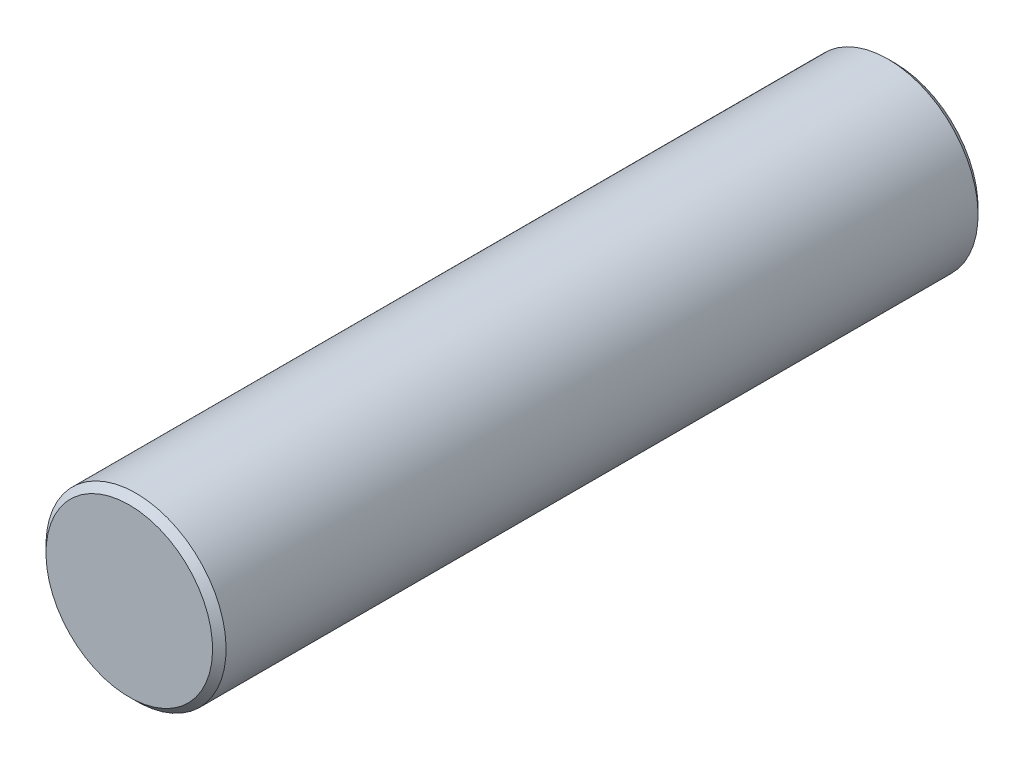
ISO-10303-21;
HEADER;
FILE_DESCRIPTION(('STEP AP214'),'2;1');
FILE_NAME('part.step','',(''),(''),'','','');
FILE_SCHEMA(('AUTOMOTIVE_DESIGN { 1 0 10303 214 1 1 1 1 }'));
ENDSEC;
DATA;
#1=APPLICATION_CONTEXT('core data for automotive mechanical design processes');
#2=APPLICATION_PROTOCOL_DEFINITION('international standard','automotive_design',2000,#1);
#3=PRODUCT_CONTEXT('',#1,'mechanical');
#4=PRODUCT('Part','Part','',(#3));
#5=PRODUCT_RELATED_PRODUCT_CATEGORY('part','',(#4));
#6=PRODUCT_DEFINITION_FORMATION('','',#4);
#7=PRODUCT_DEFINITION_CONTEXT('part definition',#1,'design');
#8=PRODUCT_DEFINITION('design','',#6,#7);
#9=PRODUCT_DEFINITION_SHAPE('','',#8);
#10=(LENGTH_UNIT() NAMED_UNIT(*) SI_UNIT(.MILLI.,.METRE.));
#11=(NAMED_UNIT(*) PLANE_ANGLE_UNIT() SI_UNIT($,.RADIAN.));
#12=(NAMED_UNIT(*) SI_UNIT($,.STERADIAN.) SOLID_ANGLE_UNIT());
#13=UNCERTAINTY_MEASURE_WITH_UNIT(LENGTH_MEASURE(1.E-05),#10,'distance_accuracy_value','');
#14=(GEOMETRIC_REPRESENTATION_CONTEXT(3) GLOBAL_UNCERTAINTY_ASSIGNED_CONTEXT((#13)) GLOBAL_UNIT_ASSIGNED_CONTEXT((#10,
#11,#12)) REPRESENTATION_CONTEXT('',''));
#15=CARTESIAN_POINT('',(0.,0.,0.));
#16=DIRECTION('',(0.,0.,1.));
#17=DIRECTION('',(1.,0.,0.));
#18=AXIS2_PLACEMENT_3D('',#15,#16,#17);
#19=CARTESIAN_POINT('',(0.,9.25,0.));
#20=DIRECTION('',(0.,0.,-1.));
#21=DIRECTION('',(0.,1.,0.));
#22=AXIS2_PLACEMENT_3D('',#19,#20,#21);
#23=PLANE('',#22);
#24=CARTESIAN_POINT('',(0.,0.,0.));
#25=DIRECTION('',(0.,0.,-1.));
#26=DIRECTION('',(0.,1.,0.));
#27=AXIS2_PLACEMENT_3D('',#24,#25,#26);
#28=CIRCLE('',#27,18.5);
#29=CARTESIAN_POINT('',(0.,18.5,0.));
#30=VERTEX_POINT('',#29);
#31=EDGE_CURVE('E9',#30,#30,#28,.T.);
#32=ORIENTED_EDGE('',*,*,#31,.T.);
#33=EDGE_LOOP('',(#32));
#34=FACE_BOUND('',#33,.T.);
#35=CARTESIAN_POINT('',(0.,0.,0.));
#36=DIRECTION('',(0.,0.,1.));
#37=DIRECTION('',(-1.,0.,0.));
#38=AXIS2_PLACEMENT_3D('',#35,#36,#37);
#39=CIRCLE('',#38,6.);
#40=CARTESIAN_POINT('',(-6.,0.,0.));
#41=VERTEX_POINT('',#40);
#42=EDGE_CURVE('E52',#41,#41,#39,.T.);
#43=ORIENTED_EDGE('',*,*,#42,.T.);
#44=EDGE_LOOP('',(#43));
#45=FACE_BOUND('',#44,.T.);
#46=ADVANCED_FACE('F15',(#34,#45),#23,.T.);
#47=CARTESIAN_POINT('',(0.,0.,0.75));
#48=DIRECTION('',(0.,0.,1.));
#49=DIRECTION('',(0.,1.,0.));
#50=AXIS2_PLACEMENT_3D('',#47,#48,#49);
#51=CONICAL_SURFACE('',#50,19.25,0.785398163397448);
#52=CARTESIAN_POINT('',(0.,0.,1.5));
#53=DIRECTION('',(0.,0.,-1.));
#54=DIRECTION('',(0.,1.,0.));
#55=AXIS2_PLACEMENT_3D('',#52,#53,#54);
#56=CIRCLE('',#55,20.);
#57=CARTESIAN_POINT('',(0.,20.,1.5));
#58=VERTEX_POINT('',#57);
#59=EDGE_CURVE('E25',#58,#58,#56,.T.);
#60=ORIENTED_EDGE('',*,*,#59,.T.);
#61=EDGE_LOOP('',(#60));
#62=FACE_BOUND('',#61,.T.);
#63=ORIENTED_EDGE('',*,*,#31,.F.);
#64=EDGE_LOOP('',(#63));
#65=FACE_BOUND('',#64,.T.);
#66=ADVANCED_FACE('F121',(#62,#65),#51,.T.);
#67=CARTESIAN_POINT('',(0.,0.,85.));
#68=DIRECTION('',(0.,0.,1.));
#69=DIRECTION('',(0.,1.,0.));
#70=AXIS2_PLACEMENT_3D('',#67,#68,#69);
#71=CYLINDRICAL_SURFACE('',#70,20.);
#72=CARTESIAN_POINT('',(0.,0.,168.5));
#73=DIRECTION('',(0.,0.,-1.));
#74=DIRECTION('',(0.,1.,0.));
#75=AXIS2_PLACEMENT_3D('',#72,#73,#74);
#76=CIRCLE('',#75,20.);
#77=CARTESIAN_POINT('',(0.,20.,168.5));
#78=VERTEX_POINT('',#77);
#79=EDGE_CURVE('E19',#78,#78,#76,.T.);
#80=ORIENTED_EDGE('',*,*,#79,.T.);
#81=EDGE_LOOP('',(#80));
#82=FACE_BOUND('',#81,.T.);
#83=ORIENTED_EDGE('',*,*,#59,.F.);
#84=EDGE_LOOP('',(#83));
#85=FACE_BOUND('',#84,.T.);
#86=CARTESIAN_POINT('',(0.,0.,6.5));
#87=DIRECTION('',(0.,0.,-1.));
#88=DIRECTION('',(0.,1.,0.));
#89=AXIS2_PLACEMENT_3D('',#86,#87,#88);
#90=CIRCLE('',#89,20.);
#91=CARTESIAN_POINT('',(10.5356537528527,-17.,6.5));
#92=VERTEX_POINT('',#91);
#93=CARTESIAN_POINT('',(-10.5356537528527,-17.,6.5));
#94=VERTEX_POINT('',#93);
#95=EDGE_CURVE('E69',#92,#94,#90,.T.);
#96=ORIENTED_EDGE('',*,*,#95,.T.);
#97=DIRECTION('',(0.,0.,1.));
#98=VECTOR('',#97,1.);
#99=CARTESIAN_POINT('',(-10.5356537528527,-17.,8.25));
#100=LINE('',#99,#98);
#101=CARTESIAN_POINT('',(-10.5356537528527,-17.,10.));
#102=VERTEX_POINT('',#101);
#103=EDGE_CURVE('E62',#94,#102,#100,.T.);
#104=ORIENTED_EDGE('',*,*,#103,.T.);
#105=CARTESIAN_POINT('',(0.,0.,10.));
#106=DIRECTION('',(0.,0.,1.));
#107=DIRECTION('',(0.,1.,0.));
#108=AXIS2_PLACEMENT_3D('',#105,#106,#107);
#109=CIRCLE('',#108,20.);
#110=CARTESIAN_POINT('',(10.5356537528527,-17.,10.));
#111=VERTEX_POINT('',#110);
#112=EDGE_CURVE('E75',#102,#111,#109,.T.);
#113=ORIENTED_EDGE('',*,*,#112,.T.);
#114=DIRECTION('',(0.,0.,-1.));
#115=VECTOR('',#114,1.);
#116=CARTESIAN_POINT('',(10.5356537528527,-17.,8.25));
#117=LINE('',#116,#115);
#118=EDGE_CURVE('E60',#111,#92,#117,.T.);
#119=ORIENTED_EDGE('',*,*,#118,.T.);
#120=EDGE_LOOP('',(#96,#104,#113,#119));
#121=FACE_BOUND('',#120,.T.);
#122=ADVANCED_FACE('F17',(#82,#85,#121),#71,.T.);
#123=CARTESIAN_POINT('',(0.,0.,169.25));
#124=DIRECTION('',(0.,0.,-1.));
#125=DIRECTION('',(0.,1.,0.));
#126=AXIS2_PLACEMENT_3D('',#123,#124,#125);
#127=CONICAL_SURFACE('',#126,19.25,0.785398163397448);
#128=CARTESIAN_POINT('',(0.,0.,170.));
#129=DIRECTION('',(0.,0.,-1.));
#130=DIRECTION('',(0.,1.,0.));
#131=AXIS2_PLACEMENT_3D('',#128,#129,#130);
#132=CIRCLE('',#131,18.5);
#133=CARTESIAN_POINT('',(0.,18.5,170.));
#134=VERTEX_POINT('',#133);
#135=EDGE_CURVE('E44',#134,#134,#132,.T.);
#136=ORIENTED_EDGE('',*,*,#135,.T.);
#137=EDGE_LOOP('',(#136));
#138=FACE_BOUND('',#137,.T.);
#139=ORIENTED_EDGE('',*,*,#79,.F.);
#140=EDGE_LOOP('',(#139));
#141=FACE_BOUND('',#140,.T.);
#142=ADVANCED_FACE('F116',(#138,#141),#127,.T.);
#143=CARTESIAN_POINT('',(0.,9.25,170.));
#144=DIRECTION('',(0.,0.,1.));
#145=DIRECTION('',(0.,-1.,0.));
#146=AXIS2_PLACEMENT_3D('',#143,#144,#145);
#147=PLANE('',#146);
#148=ORIENTED_EDGE('',*,*,#135,.F.);
#149=EDGE_LOOP('',(#148));
#150=FACE_BOUND('',#149,.T.);
#151=ADVANCED_FACE('F110',(#150),#147,.T.);
#152=CARTESIAN_POINT('',(0.,0.,26.4586213285198));
#153=DIRECTION('',(0.,0.,-1.));
#154=DIRECTION('',(-1.,0.,0.));
#155=AXIS2_PLACEMENT_3D('',#152,#153,#154);
#156=CONICAL_SURFACE('',#155,2.52640625,1.0471975511966);
#157=CARTESIAN_POINT('',(0.,0.,25.));
#158=DIRECTION('',(0.,0.,1.));
#159=DIRECTION('',(-1.,0.,0.));
#160=AXIS2_PLACEMENT_3D('',#157,#158,#159);
#161=CIRCLE('',#160,5.0528125);
#162=CARTESIAN_POINT('',(-5.0528125,0.,25.));
#163=VERTEX_POINT('',#162);
#164=EDGE_CURVE('E51',#163,#163,#161,.T.);
#165=ORIENTED_EDGE('',*,*,#164,.F.);
#166=EDGE_LOOP('',(#165));
#167=FACE_BOUND('',#166,.T.);
#168=CARTESIAN_POINT('',(0.,0.,27.9172426570397));
#169=VERTEX_POINT('',#168);
#170=VERTEX_LOOP('',#169);
#171=FACE_BOUND('',#170,.T.);
#172=ADVANCED_FACE('F104',(#167,#171),#156,.F.);
#173=CARTESIAN_POINT('',(0.,0.,12.97359375));
#174=DIRECTION('',(0.,0.,-1.));
#175=DIRECTION('',(-1.,0.,0.));
#176=AXIS2_PLACEMENT_3D('',#173,#174,#175);
#177=CYLINDRICAL_SURFACE('',#176,5.0528125);
#178=CARTESIAN_POINT('',(0.,0.,0.9471875));
#179=DIRECTION('',(0.,0.,1.));
#180=DIRECTION('',(-1.,0.,0.));
#181=AXIS2_PLACEMENT_3D('',#178,#179,#180);
#182=CIRCLE('',#181,5.0528125);
#183=CARTESIAN_POINT('',(-5.0528125,0.,0.9471875));
#184=VERTEX_POINT('',#183);
#185=EDGE_CURVE('E57',#184,#184,#182,.T.);
#186=ORIENTED_EDGE('',*,*,#185,.F.);
#187=EDGE_LOOP('',(#186));
#188=FACE_BOUND('',#187,.T.);
#189=ORIENTED_EDGE('',*,*,#164,.T.);
#190=EDGE_LOOP('',(#189));
#191=FACE_BOUND('',#190,.T.);
#192=ADVANCED_FACE('F101',(#188,#191),#177,.F.);
#193=CARTESIAN_POINT('',(0.,0.,0.47359375));
#194=DIRECTION('',(0.,0.,-1.));
#195=DIRECTION('',(-1.,0.,0.));
#196=AXIS2_PLACEMENT_3D('',#193,#194,#195);
#197=CONICAL_SURFACE('',#196,5.52640625,0.785398163397448);
#198=ORIENTED_EDGE('',*,*,#42,.F.);
#199=EDGE_LOOP('',(#198));
#200=FACE_BOUND('',#199,.T.);
#201=ORIENTED_EDGE('',*,*,#185,.T.);
#202=EDGE_LOOP('',(#201));
#203=FACE_BOUND('',#202,.T.);
#204=ADVANCED_FACE('F99',(#200,#203),#197,.F.);
#205=CARTESIAN_POINT('',(0.,-17.,8.25));
#206=DIRECTION('',(0.,-1.,0.));
#207=DIRECTION('',(0.,0.,-1.));
#208=AXIS2_PLACEMENT_3D('',#205,#206,#207);
#209=PLANE('',#208);
#210=ORIENTED_EDGE('',*,*,#103,.F.);
#211=DIRECTION('',(1.,0.,0.));
#212=VECTOR('',#211,1.);
#213=CARTESIAN_POINT('',(0.,-17.,6.5));
#214=LINE('',#213,#212);
#215=EDGE_CURVE('E66',#94,#92,#214,.T.);
#216=ORIENTED_EDGE('',*,*,#215,.T.);
#217=ORIENTED_EDGE('',*,*,#118,.F.);
#218=DIRECTION('',(-1.,0.,0.));
#219=VECTOR('',#218,1.);
#220=CARTESIAN_POINT('',(0.,-17.,10.));
#221=LINE('',#220,#219);
#222=EDGE_CURVE('E72',#111,#102,#221,.T.);
#223=ORIENTED_EDGE('',*,*,#222,.T.);
#224=EDGE_LOOP('',(#210,#216,#217,#223));
#225=FACE_BOUND('',#224,.T.);
#226=ADVANCED_FACE('F131',(#225),#209,.T.);
#227=CARTESIAN_POINT('',(0.,-19.5,6.5));
#228=DIRECTION('',(0.,0.,1.));
#229=DIRECTION('',(1.,0.,0.));
#230=AXIS2_PLACEMENT_3D('',#227,#228,#229);
#231=PLANE('',#230);
#232=ORIENTED_EDGE('',*,*,#95,.F.);
#233=ORIENTED_EDGE('',*,*,#215,.F.);
#234=EDGE_LOOP('',(#232,#233));
#235=FACE_BOUND('',#234,.T.);
#236=ADVANCED_FACE('F135',(#235),#231,.T.);
#237=CARTESIAN_POINT('',(0.,-19.5,10.));
#238=DIRECTION('',(0.,0.,1.));
#239=DIRECTION('',(1.,0.,0.));
#240=AXIS2_PLACEMENT_3D('',#237,#238,#239);
#241=PLANE('',#240);
#242=ORIENTED_EDGE('',*,*,#112,.F.);
#243=ORIENTED_EDGE('',*,*,#222,.F.);
#244=EDGE_LOOP('',(#242,#243));
#245=FACE_BOUND('',#244,.T.);
#246=ADVANCED_FACE('F87',(#245),#241,.F.);
#247=CLOSED_SHELL('',(#46,#66,#122,#142,#151,#172,#192,#204,#226,#236,#246));
#248=MANIFOLD_SOLID_BREP('B1',#247);
#249=ADVANCED_BREP_SHAPE_REPRESENTATION('',(#18,#248),#14);
#250=SHAPE_DEFINITION_REPRESENTATION(#9,#249);
ENDSEC;
END-ISO-10303-21;
